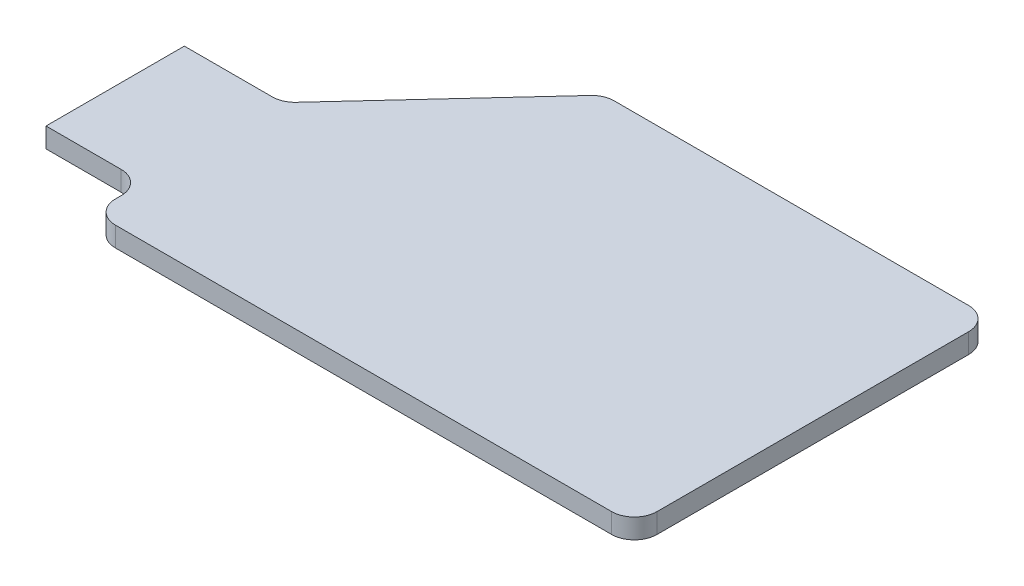
ISO-10303-21;
HEADER;
FILE_DESCRIPTION(('STEP AP214'),'2;1');
FILE_NAME('part.step','',(''),(''),'','','');
FILE_SCHEMA(('AUTOMOTIVE_DESIGN { 1 0 10303 214 1 1 1 1 }'));
ENDSEC;
DATA;
#1=APPLICATION_CONTEXT('core data for automotive mechanical design processes');
#2=APPLICATION_PROTOCOL_DEFINITION('international standard','automotive_design',2000,#1);
#3=PRODUCT_CONTEXT('',#1,'mechanical');
#4=PRODUCT('Part','Part','',(#3));
#5=PRODUCT_RELATED_PRODUCT_CATEGORY('part','',(#4));
#6=PRODUCT_DEFINITION_FORMATION('','',#4);
#7=PRODUCT_DEFINITION_CONTEXT('part definition',#1,'design');
#8=PRODUCT_DEFINITION('design','',#6,#7);
#9=PRODUCT_DEFINITION_SHAPE('','',#8);
#10=(LENGTH_UNIT() NAMED_UNIT(*) SI_UNIT(.MILLI.,.METRE.));
#11=(NAMED_UNIT(*) PLANE_ANGLE_UNIT() SI_UNIT($,.RADIAN.));
#12=(NAMED_UNIT(*) SI_UNIT($,.STERADIAN.) SOLID_ANGLE_UNIT());
#13=UNCERTAINTY_MEASURE_WITH_UNIT(LENGTH_MEASURE(1.E-05),#10,'distance_accuracy_value','');
#14=(GEOMETRIC_REPRESENTATION_CONTEXT(3) GLOBAL_UNCERTAINTY_ASSIGNED_CONTEXT((#13)) GLOBAL_UNIT_ASSIGNED_CONTEXT((#10,
#11,#12)) REPRESENTATION_CONTEXT('',''));
#15=CARTESIAN_POINT('',(0.,0.,0.));
#16=DIRECTION('',(0.,0.,1.));
#17=DIRECTION('',(1.,0.,0.));
#18=AXIS2_PLACEMENT_3D('',#15,#16,#17);
#19=CARTESIAN_POINT('',(-0.47480356969,0.28,-0.459068820856));
#20=DIRECTION('',(0.,-1.,0.));
#21=DIRECTION('',(0.,0.,-1.));
#22=AXIS2_PLACEMENT_3D('',#19,#20,#21);
#23=PLANE('',#22);
#24=DIRECTION('',(0.,0.,1.));
#25=VECTOR('',#24,1.);
#26=CARTESIAN_POINT('',(-0.63,0.28,-0.175));
#27=LINE('',#26,#25);
#28=CARTESIAN_POINT('',(-0.63,0.28,-0.419068820856));
#29=VERTEX_POINT('',#28);
#30=CARTESIAN_POINT('',(-0.63,0.28,-0.175));
#31=VERTEX_POINT('',#30);
#32=EDGE_CURVE('E21',#29,#31,#27,.T.);
#33=ORIENTED_EDGE('',*,*,#32,.F.);
#34=DIRECTION('',(-1.,0.,0.));
#35=VECTOR('',#34,1.);
#36=CARTESIAN_POINT('',(-0.63,0.28,-0.419068820856));
#37=LINE('',#36,#35);
#38=CARTESIAN_POINT('',(-0.47480356969,0.28,-0.419068820856));
#39=VERTEX_POINT('',#38);
#40=EDGE_CURVE('E28',#39,#29,#37,.T.);
#41=ORIENTED_EDGE('',*,*,#40,.F.);
#42=CARTESIAN_POINT('',(-0.47480356969,0.28,-0.459068820856));
#43=DIRECTION('',(0.,-1.,0.));
#44=DIRECTION('',(0.,0.,-1.));
#45=AXIS2_PLACEMENT_3D('',#42,#43,#44);
#46=CIRCLE('',#45,0.04);
#47=CARTESIAN_POINT('',(-0.44540171631,0.28,-0.431948145756));
#48=VERTEX_POINT('',#47);
#49=EDGE_CURVE('E251',#48,#39,#46,.T.);
#50=ORIENTED_EDGE('',*,*,#49,.F.);
#51=DIRECTION('',(-0.678016877494812,0.,0.735046334479797));
#52=VECTOR('',#51,1.);
#53=CARTESIAN_POINT('',(-0.44540171631,0.28,-0.431948145756));
#54=LINE('',#53,#52);
#55=CARTESIAN_POINT('',(-0.19657605181,0.28,-0.701703071757));
#56=VERTEX_POINT('',#55);
#57=EDGE_CURVE('E132',#56,#48,#54,.T.);
#58=ORIENTED_EDGE('',*,*,#57,.F.);
#59=CARTESIAN_POINT('',(-0.16717419843,0.28,-0.674582396658));
#60=DIRECTION('',(0.,1.,0.));
#61=DIRECTION('',(0.,0.,1.));
#62=AXIS2_PLACEMENT_3D('',#59,#60,#61);
#63=CIRCLE('',#62,0.04);
#64=CARTESIAN_POINT('',(-0.16717419843,0.28,-0.714582396658));
#65=VERTEX_POINT('',#64);
#66=EDGE_CURVE('E191',#65,#56,#63,.T.);
#67=ORIENTED_EDGE('',*,*,#66,.F.);
#68=DIRECTION('',(-1.,0.,0.));
#69=VECTOR('',#68,1.);
#70=CARTESIAN_POINT('',(-0.16717419843,0.28,-0.714582396658));
#71=LINE('',#70,#69);
#72=CARTESIAN_POINT('',(0.458042276458,0.28,-0.714582396658));
#73=VERTEX_POINT('',#72);
#74=EDGE_CURVE('E164',#73,#65,#71,.T.);
#75=ORIENTED_EDGE('',*,*,#74,.F.);
#76=CARTESIAN_POINT('',(0.458042276458,0.28,-0.674582396658));
#77=DIRECTION('',(0.,1.,0.));
#78=DIRECTION('',(0.,0.,1.));
#79=AXIS2_PLACEMENT_3D('',#76,#77,#78);
#80=CIRCLE('',#79,0.04);
#81=CARTESIAN_POINT('',(0.498042276458,0.28,-0.674582396658));
#82=VERTEX_POINT('',#81);
#83=EDGE_CURVE('E158',#82,#73,#80,.T.);
#84=ORIENTED_EDGE('',*,*,#83,.F.);
#85=DIRECTION('',(0.,0.,-1.));
#86=VECTOR('',#85,1.);
#87=CARTESIAN_POINT('',(0.498042276458,0.28,-0.674582396658));
#88=LINE('',#87,#86);
#89=CARTESIAN_POINT('',(0.498042276458,0.28,-0.124815207323));
#90=VERTEX_POINT('',#89);
#91=EDGE_CURVE('E161',#90,#82,#88,.T.);
#92=ORIENTED_EDGE('',*,*,#91,.F.);
#93=CARTESIAN_POINT('',(0.458042276458,0.28,-0.124815207323));
#94=DIRECTION('',(0.,1.,0.));
#95=DIRECTION('',(0.,0.,1.));
#96=AXIS2_PLACEMENT_3D('',#93,#94,#95);
#97=CIRCLE('',#96,0.04);
#98=CARTESIAN_POINT('',(0.458042276458,0.28,-0.08481520732348));
#99=VERTEX_POINT('',#98);
#100=EDGE_CURVE('E219',#99,#90,#97,.T.);
#101=ORIENTED_EDGE('',*,*,#100,.F.);
#102=DIRECTION('',(1.,0.,0.));
#103=VECTOR('',#102,1.);
#104=CARTESIAN_POINT('',(0.458042276458,0.28,-0.08481520732348));
#105=LINE('',#104,#103);
#106=CARTESIAN_POINT('',(-0.417281783244,0.28,-0.08481520732348));
#107=VERTEX_POINT('',#106);
#108=EDGE_CURVE('E236',#107,#99,#105,.T.);
#109=ORIENTED_EDGE('',*,*,#108,.F.);
#110=CARTESIAN_POINT('',(-0.417281783244,0.28,-0.124815207323));
#111=DIRECTION('',(0.,1.,0.));
#112=DIRECTION('',(0.,0.,1.));
#113=AXIS2_PLACEMENT_3D('',#110,#111,#112);
#114=CIRCLE('',#113,0.04);
#115=CARTESIAN_POINT('',(-0.457281783244,0.28,-0.124815207323));
#116=VERTEX_POINT('',#115);
#117=EDGE_CURVE('E197',#116,#107,#114,.T.);
#118=ORIENTED_EDGE('',*,*,#117,.F.);
#119=DIRECTION('',(0.,0.,1.));
#120=VECTOR('',#119,1.);
#121=CARTESIAN_POINT('',(-0.457281783244,0.28,-0.124815207323));
#122=LINE('',#121,#120);
#123=CARTESIAN_POINT('',(-0.457281783244,0.28,-0.135));
#124=VERTEX_POINT('',#123);
#125=EDGE_CURVE('E214',#124,#116,#122,.T.);
#126=ORIENTED_EDGE('',*,*,#125,.F.);
#127=CARTESIAN_POINT('',(-0.497281783244,0.28,-0.135));
#128=DIRECTION('',(0.,-1.,0.));
#129=DIRECTION('',(0.,0.,1.));
#130=AXIS2_PLACEMENT_3D('',#127,#128,#129);
#131=CIRCLE('',#130,0.04);
#132=CARTESIAN_POINT('',(-0.497281783244,0.28,-0.175));
#133=VERTEX_POINT('',#132);
#134=EDGE_CURVE('E258',#133,#124,#131,.T.);
#135=ORIENTED_EDGE('',*,*,#134,.F.);
#136=DIRECTION('',(1.,0.,0.));
#137=VECTOR('',#136,1.);
#138=CARTESIAN_POINT('',(-0.497281783244,0.28,-0.175));
#139=LINE('',#138,#137);
#140=EDGE_CURVE('E208',#31,#133,#139,.T.);
#141=ORIENTED_EDGE('',*,*,#140,.F.);
#142=EDGE_LOOP('',(#33,#41,#50,#58,#67,#75,#84,#92,#101,#109,#118,#126,#135,#141));
#143=FACE_BOUND('',#142,.T.);
#144=ADVANCED_FACE('F17',(#143),#23,.T.);
#145=CARTESIAN_POINT('',(-0.47480356969,0.315,-0.459068820856));
#146=DIRECTION('',(0.,-1.,0.));
#147=DIRECTION('',(0.,0.,-1.));
#148=AXIS2_PLACEMENT_3D('',#145,#146,#147);
#149=PLANE('',#148);
#150=DIRECTION('',(0.,0.,1.));
#151=VECTOR('',#150,1.);
#152=CARTESIAN_POINT('',(-0.63,0.315,-0.175));
#153=LINE('',#152,#151);
#154=CARTESIAN_POINT('',(-0.63,0.315,-0.419068820856));
#155=VERTEX_POINT('',#154);
#156=CARTESIAN_POINT('',(-0.63,0.315,-0.175));
#157=VERTEX_POINT('',#156);
#158=EDGE_CURVE('E209',#155,#157,#153,.T.);
#159=ORIENTED_EDGE('',*,*,#158,.T.);
#160=DIRECTION('',(1.,0.,0.));
#161=VECTOR('',#160,1.);
#162=CARTESIAN_POINT('',(-0.497281783244,0.315,-0.175));
#163=LINE('',#162,#161);
#164=CARTESIAN_POINT('',(-0.497281783244,0.315,-0.175));
#165=VERTEX_POINT('',#164);
#166=EDGE_CURVE('E261',#157,#165,#163,.T.);
#167=ORIENTED_EDGE('',*,*,#166,.T.);
#168=CARTESIAN_POINT('',(-0.497281783244,0.315,-0.135));
#169=DIRECTION('',(0.,-1.,0.));
#170=DIRECTION('',(0.,0.,1.));
#171=AXIS2_PLACEMENT_3D('',#168,#169,#170);
#172=CIRCLE('',#171,0.04);
#173=CARTESIAN_POINT('',(-0.457281783244,0.315,-0.135));
#174=VERTEX_POINT('',#173);
#175=EDGE_CURVE('E210',#165,#174,#172,.T.);
#176=ORIENTED_EDGE('',*,*,#175,.T.);
#177=DIRECTION('',(0.,0.,1.));
#178=VECTOR('',#177,1.);
#179=CARTESIAN_POINT('',(-0.457281783244,0.315,-0.124815207323));
#180=LINE('',#179,#178);
#181=CARTESIAN_POINT('',(-0.457281783244,0.315,-0.124815207323));
#182=VERTEX_POINT('',#181);
#183=EDGE_CURVE('E227',#174,#182,#180,.T.);
#184=ORIENTED_EDGE('',*,*,#183,.T.);
#185=CARTESIAN_POINT('',(-0.417281783244,0.315,-0.124815207323));
#186=DIRECTION('',(0.,1.,0.));
#187=DIRECTION('',(0.,0.,1.));
#188=AXIS2_PLACEMENT_3D('',#185,#186,#187);
#189=CIRCLE('',#188,0.04);
#190=CARTESIAN_POINT('',(-0.417281783244,0.315,-0.08481520732348));
#191=VERTEX_POINT('',#190);
#192=EDGE_CURVE('E196',#182,#191,#189,.T.);
#193=ORIENTED_EDGE('',*,*,#192,.T.);
#194=DIRECTION('',(1.,0.,0.));
#195=VECTOR('',#194,1.);
#196=CARTESIAN_POINT('',(0.458042276458,0.315,-0.08481520732348));
#197=LINE('',#196,#195);
#198=CARTESIAN_POINT('',(0.458042276458,0.315,-0.08481520732348));
#199=VERTEX_POINT('',#198);
#200=EDGE_CURVE('E222',#191,#199,#197,.T.);
#201=ORIENTED_EDGE('',*,*,#200,.T.);
#202=CARTESIAN_POINT('',(0.458042276458,0.315,-0.124815207323));
#203=DIRECTION('',(0.,1.,0.));
#204=DIRECTION('',(0.,0.,1.));
#205=AXIS2_PLACEMENT_3D('',#202,#203,#204);
#206=CIRCLE('',#205,0.04);
#207=CARTESIAN_POINT('',(0.498042276458,0.315,-0.124815207323));
#208=VERTEX_POINT('',#207);
#209=EDGE_CURVE('E181',#199,#208,#206,.T.);
#210=ORIENTED_EDGE('',*,*,#209,.T.);
#211=DIRECTION('',(0.,0.,-1.));
#212=VECTOR('',#211,1.);
#213=CARTESIAN_POINT('',(0.498042276458,0.315,-0.674582396658));
#214=LINE('',#213,#212);
#215=CARTESIAN_POINT('',(0.498042276458,0.315,-0.674582396658));
#216=VERTEX_POINT('',#215);
#217=EDGE_CURVE('E168',#208,#216,#214,.T.);
#218=ORIENTED_EDGE('',*,*,#217,.T.);
#219=CARTESIAN_POINT('',(0.458042276458,0.315,-0.674582396658));
#220=DIRECTION('',(0.,1.,0.));
#221=DIRECTION('',(0.,0.,1.));
#222=AXIS2_PLACEMENT_3D('',#219,#220,#221);
#223=CIRCLE('',#222,0.04);
#224=CARTESIAN_POINT('',(0.458042276458,0.315,-0.714582396658));
#225=VERTEX_POINT('',#224);
#226=EDGE_CURVE('E151',#216,#225,#223,.T.);
#227=ORIENTED_EDGE('',*,*,#226,.T.);
#228=DIRECTION('',(-1.,0.,0.));
#229=VECTOR('',#228,1.);
#230=CARTESIAN_POINT('',(-0.16717419843,0.315,-0.714582396658));
#231=LINE('',#230,#229);
#232=CARTESIAN_POINT('',(-0.16717419843,0.315,-0.714582396658));
#233=VERTEX_POINT('',#232);
#234=EDGE_CURVE('E244',#225,#233,#231,.T.);
#235=ORIENTED_EDGE('',*,*,#234,.T.);
#236=CARTESIAN_POINT('',(-0.16717419843,0.315,-0.674582396658));
#237=DIRECTION('',(0.,1.,0.));
#238=DIRECTION('',(0.,0.,1.));
#239=AXIS2_PLACEMENT_3D('',#236,#237,#238);
#240=CIRCLE('',#239,0.04);
#241=CARTESIAN_POINT('',(-0.19657605181,0.315,-0.701703071757));
#242=VERTEX_POINT('',#241);
#243=EDGE_CURVE('E200',#233,#242,#240,.T.);
#244=ORIENTED_EDGE('',*,*,#243,.T.);
#245=DIRECTION('',(-0.678016877494812,0.,0.735046334479797));
#246=VECTOR('',#245,1.);
#247=CARTESIAN_POINT('',(-0.44540171631,0.315,-0.431948145756));
#248=LINE('',#247,#246);
#249=CARTESIAN_POINT('',(-0.44540171631,0.315,-0.431948145756));
#250=VERTEX_POINT('',#249);
#251=EDGE_CURVE('E119',#242,#250,#248,.T.);
#252=ORIENTED_EDGE('',*,*,#251,.T.);
#253=CARTESIAN_POINT('',(-0.47480356969,0.315,-0.459068820856));
#254=DIRECTION('',(0.,-1.,0.));
#255=DIRECTION('',(0.,0.,-1.));
#256=AXIS2_PLACEMENT_3D('',#253,#254,#255);
#257=CIRCLE('',#256,0.04);
#258=CARTESIAN_POINT('',(-0.47480356969,0.315,-0.419068820856));
#259=VERTEX_POINT('',#258);
#260=EDGE_CURVE('E218',#250,#259,#257,.T.);
#261=ORIENTED_EDGE('',*,*,#260,.T.);
#262=DIRECTION('',(-1.,0.,0.));
#263=VECTOR('',#262,1.);
#264=CARTESIAN_POINT('',(-0.63,0.315,-0.419068820856));
#265=LINE('',#264,#263);
#266=EDGE_CURVE('E11',#259,#155,#265,.T.);
#267=ORIENTED_EDGE('',*,*,#266,.T.);
#268=EDGE_LOOP('',(#159,#167,#176,#184,#193,#201,#210,#218,#227,#235,#244,#252,#261,#267));
#269=FACE_BOUND('',#268,.T.);
#270=ADVANCED_FACE('F285',(#269),#149,.F.);
#271=CARTESIAN_POINT('',(-0.63,0.315,-0.419068820856));
#272=DIRECTION('',(0.,0.,1.));
#273=DIRECTION('',(1.,0.,0.));
#274=AXIS2_PLACEMENT_3D('',#271,#272,#273);
#275=PLANE('',#274);
#276=ORIENTED_EDGE('',*,*,#40,.T.);
#277=DIRECTION('',(0.,-1.,0.));
#278=VECTOR('',#277,1.);
#279=CARTESIAN_POINT('',(-0.63,0.315,-0.419068820856));
#280=LINE('',#279,#278);
#281=EDGE_CURVE('E204',#155,#29,#280,.T.);
#282=ORIENTED_EDGE('',*,*,#281,.F.);
#283=ORIENTED_EDGE('',*,*,#266,.F.);
#284=DIRECTION('',(0.,-1.,0.));
#285=VECTOR('',#284,1.);
#286=CARTESIAN_POINT('',(-0.47480356969,0.315,-0.419068820856));
#287=LINE('',#286,#285);
#288=EDGE_CURVE('E238',#259,#39,#287,.T.);
#289=ORIENTED_EDGE('',*,*,#288,.T.);
#290=EDGE_LOOP('',(#276,#282,#283,#289));
#291=FACE_BOUND('',#290,.T.);
#292=ADVANCED_FACE('F19',(#291),#275,.F.);
#293=CARTESIAN_POINT('',(-0.47480356969,0.315,-0.459068820856));
#294=DIRECTION('',(0.,-1.,0.));
#295=DIRECTION('',(0.,0.,-1.));
#296=AXIS2_PLACEMENT_3D('',#293,#294,#295);
#297=CYLINDRICAL_SURFACE('',#296,0.04);
#298=ORIENTED_EDGE('',*,*,#49,.T.);
#299=ORIENTED_EDGE('',*,*,#288,.F.);
#300=ORIENTED_EDGE('',*,*,#260,.F.);
#301=DIRECTION('',(0.,-1.,0.));
#302=VECTOR('',#301,1.);
#303=CARTESIAN_POINT('',(-0.44540171631,0.315,-0.431948145756));
#304=LINE('',#303,#302);
#305=EDGE_CURVE('E228',#250,#48,#304,.T.);
#306=ORIENTED_EDGE('',*,*,#305,.T.);
#307=EDGE_LOOP('',(#298,#299,#300,#306));
#308=FACE_BOUND('',#307,.T.);
#309=ADVANCED_FACE('F325',(#308),#297,.F.);
#310=CARTESIAN_POINT('',(-0.44540171631,0.315,-0.431948145756));
#311=DIRECTION('',(0.735046334479797,0.,0.678016877494812));
#312=DIRECTION('',(0.,-1.,0.));
#313=AXIS2_PLACEMENT_3D('',#310,#311,#312);
#314=PLANE('',#313);
#315=ORIENTED_EDGE('',*,*,#57,.T.);
#316=ORIENTED_EDGE('',*,*,#305,.F.);
#317=ORIENTED_EDGE('',*,*,#251,.F.);
#318=DIRECTION('',(0.,-1.,0.));
#319=VECTOR('',#318,1.);
#320=CARTESIAN_POINT('',(-0.19657605181,0.315,-0.701703071757));
#321=LINE('',#320,#319);
#322=EDGE_CURVE('E198',#242,#56,#321,.T.);
#323=ORIENTED_EDGE('',*,*,#322,.T.);
#324=EDGE_LOOP('',(#315,#316,#317,#323));
#325=FACE_BOUND('',#324,.T.);
#326=ADVANCED_FACE('F323',(#325),#314,.F.);
#327=CARTESIAN_POINT('',(-0.16717419843,0.315,-0.674582396658));
#328=DIRECTION('',(0.,-1.,0.));
#329=DIRECTION('',(0.,0.,-1.));
#330=AXIS2_PLACEMENT_3D('',#327,#328,#329);
#331=CYLINDRICAL_SURFACE('',#330,0.04);
#332=ORIENTED_EDGE('',*,*,#66,.T.);
#333=ORIENTED_EDGE('',*,*,#322,.F.);
#334=ORIENTED_EDGE('',*,*,#243,.F.);
#335=DIRECTION('',(0.,-1.,0.));
#336=VECTOR('',#335,1.);
#337=CARTESIAN_POINT('',(-0.16717419843,0.315,-0.714582396658));
#338=LINE('',#337,#336);
#339=EDGE_CURVE('E248',#233,#65,#338,.T.);
#340=ORIENTED_EDGE('',*,*,#339,.T.);
#341=EDGE_LOOP('',(#332,#333,#334,#340));
#342=FACE_BOUND('',#341,.T.);
#343=ADVANCED_FACE('F318',(#342),#331,.T.);
#344=CARTESIAN_POINT('',(-0.16717419843,0.315,-0.714582396658));
#345=DIRECTION('',(0.,0.,1.));
#346=DIRECTION('',(1.,0.,0.));
#347=AXIS2_PLACEMENT_3D('',#344,#345,#346);
#348=PLANE('',#347);
#349=ORIENTED_EDGE('',*,*,#74,.T.);
#350=ORIENTED_EDGE('',*,*,#339,.F.);
#351=ORIENTED_EDGE('',*,*,#234,.F.);
#352=DIRECTION('',(0.,-1.,0.));
#353=VECTOR('',#352,1.);
#354=CARTESIAN_POINT('',(0.458042276458,0.315,-0.714582396658));
#355=LINE('',#354,#353);
#356=EDGE_CURVE('E167',#225,#73,#355,.T.);
#357=ORIENTED_EDGE('',*,*,#356,.T.);
#358=EDGE_LOOP('',(#349,#350,#351,#357));
#359=FACE_BOUND('',#358,.T.);
#360=ADVANCED_FACE('F281',(#359),#348,.F.);
#361=CARTESIAN_POINT('',(0.458042276458,0.315,-0.674582396658));
#362=DIRECTION('',(0.,-1.,0.));
#363=DIRECTION('',(0.,0.,-1.));
#364=AXIS2_PLACEMENT_3D('',#361,#362,#363);
#365=CYLINDRICAL_SURFACE('',#364,0.04);
#366=ORIENTED_EDGE('',*,*,#83,.T.);
#367=ORIENTED_EDGE('',*,*,#356,.F.);
#368=ORIENTED_EDGE('',*,*,#226,.F.);
#369=DIRECTION('',(0.,-1.,0.));
#370=VECTOR('',#369,1.);
#371=CARTESIAN_POINT('',(0.498042276458,0.315,-0.674582396658));
#372=LINE('',#371,#370);
#373=EDGE_CURVE('E171',#216,#82,#372,.T.);
#374=ORIENTED_EDGE('',*,*,#373,.T.);
#375=EDGE_LOOP('',(#366,#367,#368,#374));
#376=FACE_BOUND('',#375,.T.);
#377=ADVANCED_FACE('F172',(#376),#365,.T.);
#378=CARTESIAN_POINT('',(0.498042276458,0.315,-0.674582396658));
#379=DIRECTION('',(-1.,0.,0.));
#380=DIRECTION('',(0.,0.,1.));
#381=AXIS2_PLACEMENT_3D('',#378,#379,#380);
#382=PLANE('',#381);
#383=ORIENTED_EDGE('',*,*,#91,.T.);
#384=ORIENTED_EDGE('',*,*,#373,.F.);
#385=ORIENTED_EDGE('',*,*,#217,.F.);
#386=DIRECTION('',(0.,-1.,0.));
#387=VECTOR('',#386,1.);
#388=CARTESIAN_POINT('',(0.498042276458,0.315,-0.124815207323));
#389=LINE('',#388,#387);
#390=EDGE_CURVE('E178',#208,#90,#389,.T.);
#391=ORIENTED_EDGE('',*,*,#390,.T.);
#392=EDGE_LOOP('',(#383,#384,#385,#391));
#393=FACE_BOUND('',#392,.T.);
#394=ADVANCED_FACE('F176',(#393),#382,.F.);
#395=CARTESIAN_POINT('',(0.458042276458,0.315,-0.124815207323));
#396=DIRECTION('',(0.,-1.,0.));
#397=DIRECTION('',(0.,0.,-1.));
#398=AXIS2_PLACEMENT_3D('',#395,#396,#397);
#399=CYLINDRICAL_SURFACE('',#398,0.04);
#400=ORIENTED_EDGE('',*,*,#100,.T.);
#401=ORIENTED_EDGE('',*,*,#390,.F.);
#402=ORIENTED_EDGE('',*,*,#209,.F.);
#403=DIRECTION('',(0.,-1.,0.));
#404=VECTOR('',#403,1.);
#405=CARTESIAN_POINT('',(0.458042276458,0.315,-0.08481520732348));
#406=LINE('',#405,#404);
#407=EDGE_CURVE('E232',#199,#99,#406,.T.);
#408=ORIENTED_EDGE('',*,*,#407,.T.);
#409=EDGE_LOOP('',(#400,#401,#402,#408));
#410=FACE_BOUND('',#409,.T.);
#411=ADVANCED_FACE('F376',(#410),#399,.T.);
#412=CARTESIAN_POINT('',(0.458042276458,0.315,-0.08481520732348));
#413=DIRECTION('',(0.,0.,-1.));
#414=DIRECTION('',(0.,-1.,0.));
#415=AXIS2_PLACEMENT_3D('',#412,#413,#414);
#416=PLANE('',#415);
#417=ORIENTED_EDGE('',*,*,#108,.T.);
#418=ORIENTED_EDGE('',*,*,#407,.F.);
#419=ORIENTED_EDGE('',*,*,#200,.F.);
#420=DIRECTION('',(0.,-1.,0.));
#421=VECTOR('',#420,1.);
#422=CARTESIAN_POINT('',(-0.417281783244,0.315,-0.08481520732348));
#423=LINE('',#422,#421);
#424=EDGE_CURVE('E193',#191,#107,#423,.T.);
#425=ORIENTED_EDGE('',*,*,#424,.T.);
#426=EDGE_LOOP('',(#417,#418,#419,#425));
#427=FACE_BOUND('',#426,.T.);
#428=ADVANCED_FACE('F380',(#427),#416,.F.);
#429=CARTESIAN_POINT('',(-0.417281783244,0.315,-0.124815207323));
#430=DIRECTION('',(0.,-1.,0.));
#431=DIRECTION('',(0.,0.,-1.));
#432=AXIS2_PLACEMENT_3D('',#429,#430,#431);
#433=CYLINDRICAL_SURFACE('',#432,0.04);
#434=ORIENTED_EDGE('',*,*,#117,.T.);
#435=ORIENTED_EDGE('',*,*,#424,.F.);
#436=ORIENTED_EDGE('',*,*,#192,.F.);
#437=DIRECTION('',(0.,-1.,0.));
#438=VECTOR('',#437,1.);
#439=CARTESIAN_POINT('',(-0.457281783244,0.315,-0.124815207323));
#440=LINE('',#439,#438);
#441=EDGE_CURVE('E223',#182,#116,#440,.T.);
#442=ORIENTED_EDGE('',*,*,#441,.T.);
#443=EDGE_LOOP('',(#434,#435,#436,#442));
#444=FACE_BOUND('',#443,.T.);
#445=ADVANCED_FACE('F421',(#444),#433,.T.);
#446=CARTESIAN_POINT('',(-0.457281783244,0.315,-0.124815207323));
#447=DIRECTION('',(1.,0.,0.));
#448=DIRECTION('',(0.,1.,0.));
#449=AXIS2_PLACEMENT_3D('',#446,#447,#448);
#450=PLANE('',#449);
#451=ORIENTED_EDGE('',*,*,#125,.T.);
#452=ORIENTED_EDGE('',*,*,#441,.F.);
#453=ORIENTED_EDGE('',*,*,#183,.F.);
#454=DIRECTION('',(0.,-1.,0.));
#455=VECTOR('',#454,1.);
#456=CARTESIAN_POINT('',(-0.457281783244,0.315,-0.135));
#457=LINE('',#456,#455);
#458=EDGE_CURVE('E215',#174,#124,#457,.T.);
#459=ORIENTED_EDGE('',*,*,#458,.T.);
#460=EDGE_LOOP('',(#451,#452,#453,#459));
#461=FACE_BOUND('',#460,.T.);
#462=ADVANCED_FACE('F416',(#461),#450,.F.);
#463=CARTESIAN_POINT('',(-0.497281783244,0.315,-0.135));
#464=DIRECTION('',(0.,-1.,0.));
#465=DIRECTION('',(0.,0.,-1.));
#466=AXIS2_PLACEMENT_3D('',#463,#464,#465);
#467=CYLINDRICAL_SURFACE('',#466,0.04);
#468=ORIENTED_EDGE('',*,*,#134,.T.);
#469=ORIENTED_EDGE('',*,*,#458,.F.);
#470=ORIENTED_EDGE('',*,*,#175,.F.);
#471=DIRECTION('',(0.,-1.,0.));
#472=VECTOR('',#471,1.);
#473=CARTESIAN_POINT('',(-0.497281783244,0.315,-0.175));
#474=LINE('',#473,#472);
#475=EDGE_CURVE('E265',#165,#133,#474,.T.);
#476=ORIENTED_EDGE('',*,*,#475,.T.);
#477=EDGE_LOOP('',(#468,#469,#470,#476));
#478=FACE_BOUND('',#477,.T.);
#479=ADVANCED_FACE('F420',(#478),#467,.F.);
#480=CARTESIAN_POINT('',(-0.497281783244,0.315,-0.175));
#481=DIRECTION('',(0.,0.,-1.));
#482=DIRECTION('',(-1.,0.,0.));
#483=AXIS2_PLACEMENT_3D('',#480,#481,#482);
#484=PLANE('',#483);
#485=ORIENTED_EDGE('',*,*,#140,.T.);
#486=ORIENTED_EDGE('',*,*,#475,.F.);
#487=ORIENTED_EDGE('',*,*,#166,.F.);
#488=DIRECTION('',(0.,-1.,0.));
#489=VECTOR('',#488,1.);
#490=CARTESIAN_POINT('',(-0.63,0.315,-0.175));
#491=LINE('',#490,#489);
#492=EDGE_CURVE('E276',#157,#31,#491,.T.);
#493=ORIENTED_EDGE('',*,*,#492,.T.);
#494=EDGE_LOOP('',(#485,#486,#487,#493));
#495=FACE_BOUND('',#494,.T.);
#496=ADVANCED_FACE('F391',(#495),#484,.F.);
#497=CARTESIAN_POINT('',(-0.63,0.315,-0.175));
#498=DIRECTION('',(1.,0.,0.));
#499=DIRECTION('',(0.,0.,-1.));
#500=AXIS2_PLACEMENT_3D('',#497,#498,#499);
#501=PLANE('',#500);
#502=ORIENTED_EDGE('',*,*,#32,.T.);
#503=ORIENTED_EDGE('',*,*,#492,.F.);
#504=ORIENTED_EDGE('',*,*,#158,.F.);
#505=ORIENTED_EDGE('',*,*,#281,.T.);
#506=EDGE_LOOP('',(#502,#503,#504,#505));
#507=FACE_BOUND('',#506,.T.);
#508=ADVANCED_FACE('F329',(#507),#501,.F.);
#509=CLOSED_SHELL('',(#144,#270,#292,#309,#326,#343,#360,#377,#394,#411,#428,#445,#462,#479,
#496,#508));
#510=MANIFOLD_SOLID_BREP('B1',#509);
#511=ADVANCED_BREP_SHAPE_REPRESENTATION('',(#18,#510),#14);
#512=SHAPE_DEFINITION_REPRESENTATION(#9,#511);
ENDSEC;
END-ISO-10303-21;
